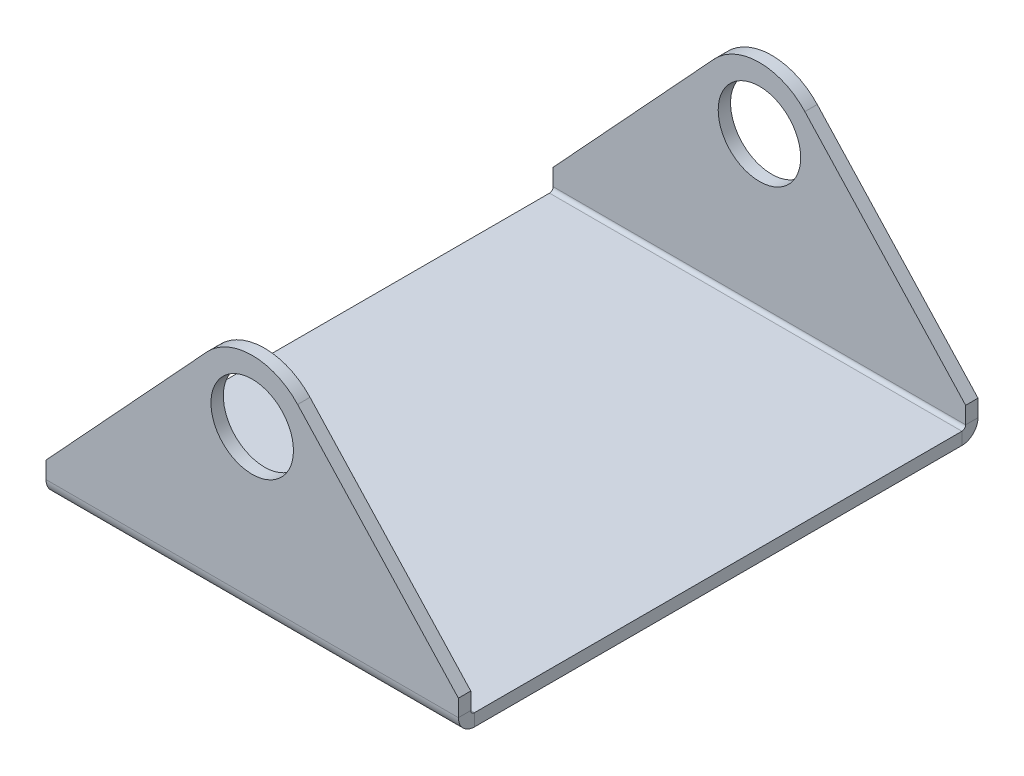
ISO-10303-21;
HEADER;
FILE_DESCRIPTION(('STEP AP214'),'2;1');
FILE_NAME('part.step','',(''),(''),'','','');
FILE_SCHEMA(('AUTOMOTIVE_DESIGN { 1 0 10303 214 1 1 1 1 }'));
ENDSEC;
DATA;
#1=APPLICATION_CONTEXT('core data for automotive mechanical design processes');
#2=APPLICATION_PROTOCOL_DEFINITION('international standard','automotive_design',2000,#1);
#3=PRODUCT_CONTEXT('',#1,'mechanical');
#4=PRODUCT('Part','Part','',(#3));
#5=PRODUCT_RELATED_PRODUCT_CATEGORY('part','',(#4));
#6=PRODUCT_DEFINITION_FORMATION('','',#4);
#7=PRODUCT_DEFINITION_CONTEXT('part definition',#1,'design');
#8=PRODUCT_DEFINITION('design','',#6,#7);
#9=PRODUCT_DEFINITION_SHAPE('','',#8);
#10=(LENGTH_UNIT() NAMED_UNIT(*) SI_UNIT(.MILLI.,.METRE.));
#11=(NAMED_UNIT(*) PLANE_ANGLE_UNIT() SI_UNIT($,.RADIAN.));
#12=(NAMED_UNIT(*) SI_UNIT($,.STERADIAN.) SOLID_ANGLE_UNIT());
#13=UNCERTAINTY_MEASURE_WITH_UNIT(LENGTH_MEASURE(1.E-05),#10,'distance_accuracy_value','');
#14=(GEOMETRIC_REPRESENTATION_CONTEXT(3) GLOBAL_UNCERTAINTY_ASSIGNED_CONTEXT((#13)) GLOBAL_UNIT_ASSIGNED_CONTEXT((#10,
#11,#12)) REPRESENTATION_CONTEXT('',''));
#15=CARTESIAN_POINT('',(0.,0.,0.));
#16=DIRECTION('',(0.,0.,1.));
#17=DIRECTION('',(1.,0.,0.));
#18=AXIS2_PLACEMENT_3D('',#15,#16,#17);
#19=CARTESIAN_POINT('',(0.,3.,-120.));
#20=DIRECTION('',(0.,-1.,0.));
#21=DIRECTION('',(0.,0.,-1.));
#22=AXIS2_PLACEMENT_3D('',#19,#20,#21);
#23=PLANE('',#22);
#24=DIRECTION('',(1.,0.,0.));
#25=VECTOR('',#24,1.);
#26=CARTESIAN_POINT('',(0.,3.,-119.1));
#27=LINE('',#26,#25);
#28=CARTESIAN_POINT('',(0.,3.,-119.1));
#29=VERTEX_POINT('',#28);
#30=CARTESIAN_POINT('',(100.,3.,-119.1));
#31=VERTEX_POINT('',#30);
#32=EDGE_CURVE('E291',#29,#31,#27,.T.);
#33=ORIENTED_EDGE('',*,*,#32,.F.);
#34=DIRECTION('',(0.,0.,1.));
#35=VECTOR('',#34,1.);
#36=CARTESIAN_POINT('',(0.,3.,0.));
#37=LINE('',#36,#35);
#38=CARTESIAN_POINT('',(0.,3.,-0.899999999999997));
#39=VERTEX_POINT('',#38);
#40=EDGE_CURVE('E270',#29,#39,#37,.T.);
#41=ORIENTED_EDGE('',*,*,#40,.T.);
#42=DIRECTION('',(-1.,0.,0.));
#43=VECTOR('',#42,1.);
#44=CARTESIAN_POINT('',(100.,3.,-0.899999999999997));
#45=LINE('',#44,#43);
#46=CARTESIAN_POINT('',(100.,3.,-0.899999999999997));
#47=VERTEX_POINT('',#46);
#48=EDGE_CURVE('E277',#47,#39,#45,.T.);
#49=ORIENTED_EDGE('',*,*,#48,.F.);
#50=DIRECTION('',(0.,0.,-1.));
#51=VECTOR('',#50,1.);
#52=CARTESIAN_POINT('',(100.,3.,0.));
#53=LINE('',#52,#51);
#54=EDGE_CURVE('E273',#47,#31,#53,.T.);
#55=ORIENTED_EDGE('',*,*,#54,.T.);
#56=EDGE_LOOP('',(#33,#41,#49,#55));
#57=FACE_BOUND('',#56,.T.);
#58=ADVANCED_FACE('F36',(#57),#23,.F.);
#59=CARTESIAN_POINT('',(0.,0.,-120.));
#60=DIRECTION('',(0.,-1.,0.));
#61=DIRECTION('',(0.,0.,-1.));
#62=AXIS2_PLACEMENT_3D('',#59,#60,#61);
#63=PLANE('',#62);
#64=DIRECTION('',(0.,0.,-1.));
#65=VECTOR('',#64,1.);
#66=CARTESIAN_POINT('',(0.,0.,-120.));
#67=LINE('',#66,#65);
#68=CARTESIAN_POINT('',(0.,0.,-119.1));
#69=VERTEX_POINT('',#68);
#70=CARTESIAN_POINT('',(0.,0.,-0.899999999999996));
#71=VERTEX_POINT('',#70);
#72=EDGE_CURVE('E266',#69,#71,#67,.F.);
#73=ORIENTED_EDGE('',*,*,#72,.F.);
#74=DIRECTION('',(1.,0.,0.));
#75=VECTOR('',#74,1.);
#76=CARTESIAN_POINT('',(0.,0.,-119.1));
#77=LINE('',#76,#75);
#78=CARTESIAN_POINT('',(100.,0.,-119.1));
#79=VERTEX_POINT('',#78);
#80=EDGE_CURVE('E44',#69,#79,#77,.T.);
#81=ORIENTED_EDGE('',*,*,#80,.T.);
#82=DIRECTION('',(0.,0.,-1.));
#83=VECTOR('',#82,1.);
#84=CARTESIAN_POINT('',(100.,0.,-120.));
#85=LINE('',#84,#83);
#86=CARTESIAN_POINT('',(100.,0.,-0.899999999999997));
#87=VERTEX_POINT('',#86);
#88=EDGE_CURVE('E274',#87,#79,#85,.T.);
#89=ORIENTED_EDGE('',*,*,#88,.F.);
#90=DIRECTION('',(-1.,0.,0.));
#91=VECTOR('',#90,1.);
#92=CARTESIAN_POINT('',(100.,0.,-0.899999999999997));
#93=LINE('',#92,#91);
#94=EDGE_CURVE('E285',#87,#71,#93,.T.);
#95=ORIENTED_EDGE('',*,*,#94,.T.);
#96=EDGE_LOOP('',(#73,#81,#89,#95));
#97=FACE_BOUND('',#96,.T.);
#98=ADVANCED_FACE('F298',(#97),#63,.T.);
#99=CARTESIAN_POINT('',(0.,3.,0.));
#100=DIRECTION('',(1.,0.,0.));
#101=DIRECTION('',(0.,0.,1.));
#102=AXIS2_PLACEMENT_3D('',#99,#100,#101);
#103=PLANE('',#102);
#104=ORIENTED_EDGE('',*,*,#40,.F.);
#105=DIRECTION('',(0.,-1.,0.));
#106=VECTOR('',#105,1.);
#107=CARTESIAN_POINT('',(0.,3.,-119.1));
#108=LINE('',#107,#106);
#109=EDGE_CURVE('E11',#29,#69,#108,.T.);
#110=ORIENTED_EDGE('',*,*,#109,.T.);
#111=ORIENTED_EDGE('',*,*,#72,.T.);
#112=DIRECTION('',(0.,-1.,0.));
#113=VECTOR('',#112,1.);
#114=CARTESIAN_POINT('',(0.,3.,-0.899999999999997));
#115=LINE('',#114,#113);
#116=EDGE_CURVE('E283',#39,#71,#115,.T.);
#117=ORIENTED_EDGE('',*,*,#116,.F.);
#118=EDGE_LOOP('',(#104,#110,#111,#117));
#119=FACE_BOUND('',#118,.T.);
#120=ADVANCED_FACE('F321',(#119),#103,.F.);
#121=CARTESIAN_POINT('',(100.,3.,0.));
#122=DIRECTION('',(-1.,0.,0.));
#123=DIRECTION('',(0.,0.,-1.));
#124=AXIS2_PLACEMENT_3D('',#121,#122,#123);
#125=PLANE('',#124);
#126=DIRECTION('',(0.,-1.,0.));
#127=VECTOR('',#126,1.);
#128=CARTESIAN_POINT('',(100.,3.,-119.1));
#129=LINE('',#128,#127);
#130=EDGE_CURVE('E293',#31,#79,#129,.T.);
#131=ORIENTED_EDGE('',*,*,#130,.F.);
#132=ORIENTED_EDGE('',*,*,#54,.F.);
#133=DIRECTION('',(0.,-1.,0.));
#134=VECTOR('',#133,1.);
#135=CARTESIAN_POINT('',(100.,3.,-0.899999999999997));
#136=LINE('',#135,#134);
#137=EDGE_CURVE('E288',#47,#87,#136,.T.);
#138=ORIENTED_EDGE('',*,*,#137,.T.);
#139=ORIENTED_EDGE('',*,*,#88,.T.);
#140=EDGE_LOOP('',(#131,#132,#138,#139));
#141=FACE_BOUND('',#140,.T.);
#142=ADVANCED_FACE('F38',(#141),#125,.F.);
#143=CARTESIAN_POINT('',(100.,3.9,-0.899999999999997));
#144=DIRECTION('',(-1.,0.,0.));
#145=DIRECTION('',(0.,0.,1.));
#146=AXIS2_PLACEMENT_3D('',#143,#144,#145);
#147=PLANE('',#146);
#148=DIRECTION('',(0.,0.,1.));
#149=VECTOR('',#148,1.);
#150=CARTESIAN_POINT('',(100.,3.90000000000002,0.));
#151=LINE('',#150,#149);
#152=CARTESIAN_POINT('',(100.,3.89999999999999,0.));
#153=VERTEX_POINT('',#152);
#154=CARTESIAN_POINT('',(100.,3.90000000000002,2.99999999999999));
#155=VERTEX_POINT('',#154);
#156=EDGE_CURVE('E255',#153,#155,#151,.T.);
#157=ORIENTED_EDGE('',*,*,#156,.T.);
#158=CARTESIAN_POINT('',(100.,3.9,-0.899999999999997));
#159=DIRECTION('',(1.,0.,0.));
#160=DIRECTION('',(0.,0.,-1.));
#161=AXIS2_PLACEMENT_3D('',#158,#159,#160);
#162=CIRCLE('',#161,3.9);
#163=EDGE_CURVE('E59',#155,#87,#162,.T.);
#164=ORIENTED_EDGE('',*,*,#163,.T.);
#165=ORIENTED_EDGE('',*,*,#137,.F.);
#166=CARTESIAN_POINT('',(100.,3.9,-0.899999999999997));
#167=DIRECTION('',(1.,0.,0.));
#168=DIRECTION('',(0.,0.,-1.));
#169=AXIS2_PLACEMENT_3D('',#166,#167,#168);
#170=CIRCLE('',#169,0.9);
#171=EDGE_CURVE('E259',#153,#47,#170,.T.);
#172=ORIENTED_EDGE('',*,*,#171,.F.);
#173=EDGE_LOOP('',(#157,#164,#165,#172));
#174=FACE_BOUND('',#173,.T.);
#175=ADVANCED_FACE('F311',(#174),#147,.F.);
#176=CARTESIAN_POINT('',(0.,3.9,-0.899999999999997));
#177=DIRECTION('',(1.,0.,0.));
#178=DIRECTION('',(0.,0.,-1.));
#179=AXIS2_PLACEMENT_3D('',#176,#177,#178);
#180=PLANE('',#179);
#181=CARTESIAN_POINT('',(0.,3.9,-0.899999999999997));
#182=DIRECTION('',(1.,0.,0.));
#183=DIRECTION('',(0.,0.,-1.));
#184=AXIS2_PLACEMENT_3D('',#181,#182,#183);
#185=CIRCLE('',#184,3.9);
#186=CARTESIAN_POINT('',(0.,3.90000000000001,2.99999999999999));
#187=VERTEX_POINT('',#186);
#188=EDGE_CURVE('E263',#71,#187,#185,.F.);
#189=ORIENTED_EDGE('',*,*,#188,.T.);
#190=DIRECTION('',(0.,0.,1.));
#191=VECTOR('',#190,1.);
#192=CARTESIAN_POINT('',(0.,3.90000000000002,0.));
#193=LINE('',#192,#191);
#194=CARTESIAN_POINT('',(0.,3.90000000000002,0.));
#195=VERTEX_POINT('',#194);
#196=EDGE_CURVE('E215',#195,#187,#193,.T.);
#197=ORIENTED_EDGE('',*,*,#196,.F.);
#198=CARTESIAN_POINT('',(0.,3.9,-0.899999999999997));
#199=DIRECTION('',(-1.,0.,0.));
#200=DIRECTION('',(0.,0.,1.));
#201=AXIS2_PLACEMENT_3D('',#198,#199,#200);
#202=CIRCLE('',#201,0.9);
#203=EDGE_CURVE('E262',#39,#195,#202,.T.);
#204=ORIENTED_EDGE('',*,*,#203,.F.);
#205=ORIENTED_EDGE('',*,*,#116,.T.);
#206=EDGE_LOOP('',(#189,#197,#204,#205));
#207=FACE_BOUND('',#206,.T.);
#208=ADVANCED_FACE('F324',(#207),#180,.F.);
#209=CARTESIAN_POINT('',(-50.1159938787883,3.9,-0.899999999999997));
#210=DIRECTION('',(1.,0.,0.));
#211=DIRECTION('',(0.,0.,-1.));
#212=AXIS2_PLACEMENT_3D('',#209,#210,#211);
#213=CYLINDRICAL_SURFACE('',#212,0.9);
#214=ORIENTED_EDGE('',*,*,#48,.T.);
#215=ORIENTED_EDGE('',*,*,#203,.T.);
#216=DIRECTION('',(1.,0.,0.));
#217=VECTOR('',#216,1.);
#218=CARTESIAN_POINT('',(0.,3.90000000000002,0.));
#219=LINE('',#218,#217);
#220=EDGE_CURVE('E202',#195,#153,#219,.T.);
#221=ORIENTED_EDGE('',*,*,#220,.T.);
#222=ORIENTED_EDGE('',*,*,#171,.T.);
#223=EDGE_LOOP('',(#214,#215,#221,#222));
#224=FACE_BOUND('',#223,.T.);
#225=ADVANCED_FACE('F314',(#224),#213,.F.);
#226=CARTESIAN_POINT('',(-50.1159938787883,3.9,-0.899999999999997));
#227=DIRECTION('',(1.,0.,0.));
#228=DIRECTION('',(0.,0.,-1.));
#229=AXIS2_PLACEMENT_3D('',#226,#227,#228);
#230=CYLINDRICAL_SURFACE('',#229,3.9);
#231=ORIENTED_EDGE('',*,*,#94,.F.);
#232=ORIENTED_EDGE('',*,*,#163,.F.);
#233=DIRECTION('',(1.,0.,0.));
#234=VECTOR('',#233,1.);
#235=CARTESIAN_POINT('',(100.,3.90000000000002,2.99999999999999));
#236=LINE('',#235,#234);
#237=EDGE_CURVE('E212',#187,#155,#236,.T.);
#238=ORIENTED_EDGE('',*,*,#237,.F.);
#239=ORIENTED_EDGE('',*,*,#188,.F.);
#240=EDGE_LOOP('',(#231,#232,#238,#239));
#241=FACE_BOUND('',#240,.T.);
#242=ADVANCED_FACE('F328',(#241),#230,.T.);
#243=CARTESIAN_POINT('',(50.,40.,1.08853898117545E-13));
#244=DIRECTION('',(0.,0.,1.));
#245=DIRECTION('',(0.,-1.,0.));
#246=AXIS2_PLACEMENT_3D('',#243,#244,#245);
#247=CYLINDRICAL_SURFACE('',#246,15.);
#248=CARTESIAN_POINT('',(50.,40.,3.00000000000011));
#249=DIRECTION('',(0.,0.,1.));
#250=DIRECTION('',(0.,-1.,0.));
#251=AXIS2_PLACEMENT_3D('',#248,#249,#250);
#252=CIRCLE('',#251,15.);
#253=CARTESIAN_POINT('',(38.984187706275,50.1809567089453,3.00000000000015));
#254=VERTEX_POINT('',#253);
#255=CARTESIAN_POINT('',(61.015812293725,50.1809567089453,3.00000000000015));
#256=VERTEX_POINT('',#255);
#257=EDGE_CURVE('E253',#254,#256,#252,.F.);
#258=ORIENTED_EDGE('',*,*,#257,.T.);
#259=DIRECTION('',(0.,0.,-1.));
#260=VECTOR('',#259,1.);
#261=CARTESIAN_POINT('',(61.015812293725,50.1809567089453,0.));
#262=LINE('',#261,#260);
#263=CARTESIAN_POINT('',(61.015812293725,50.1809567089453,0.));
#264=VERTEX_POINT('',#263);
#265=EDGE_CURVE('E243',#264,#256,#262,.F.);
#266=ORIENTED_EDGE('',*,*,#265,.F.);
#267=CARTESIAN_POINT('',(50.,40.,1.08853898117545E-13));
#268=DIRECTION('',(0.,0.,1.));
#269=DIRECTION('',(0.,-1.,0.));
#270=AXIS2_PLACEMENT_3D('',#267,#268,#269);
#271=CIRCLE('',#270,15.);
#272=CARTESIAN_POINT('',(38.984187706275,50.1809567089453,0.));
#273=VERTEX_POINT('',#272);
#274=EDGE_CURVE('E221',#273,#264,#271,.F.);
#275=ORIENTED_EDGE('',*,*,#274,.F.);
#276=DIRECTION('',(0.,0.,-1.));
#277=VECTOR('',#276,1.);
#278=CARTESIAN_POINT('',(38.984187706275,50.1809567089453,0.));
#279=LINE('',#278,#277);
#280=EDGE_CURVE('E250',#273,#254,#279,.F.);
#281=ORIENTED_EDGE('',*,*,#280,.T.);
#282=EDGE_LOOP('',(#258,#266,#275,#281));
#283=FACE_BOUND('',#282,.T.);
#284=ADVANCED_FACE('F345',(#283),#247,.T.);
#285=CARTESIAN_POINT('',(43.5752462691572,55.1484898007787,1.66099772824779E-13));
#286=DIRECTION('',(0.734387486248332,-0.678730447263018,0.));
#287=DIRECTION('',(0.678730447263018,0.734387486248332,0.));
#288=AXIS2_PLACEMENT_3D('',#285,#286,#287);
#289=PLANE('',#288);
#290=ORIENTED_EDGE('',*,*,#280,.F.);
#291=DIRECTION('',(0.678730447263018,0.734387486248332,0.));
#292=VECTOR('',#291,1.);
#293=CARTESIAN_POINT('',(43.5752462691572,55.1484898007787,1.66099772824779E-13));
#294=LINE('',#293,#292);
#295=CARTESIAN_POINT('',(0.,8.00000000000002,0.));
#296=VERTEX_POINT('',#295);
#297=EDGE_CURVE('E223',#296,#273,#294,.T.);
#298=ORIENTED_EDGE('',*,*,#297,.F.);
#299=DIRECTION('',(0.,0.,-1.));
#300=VECTOR('',#299,1.);
#301=CARTESIAN_POINT('',(0.,8.00000000000002,0.));
#302=LINE('',#301,#300);
#303=CARTESIAN_POINT('',(0.,8.00000000000001,3.));
#304=VERTEX_POINT('',#303);
#305=EDGE_CURVE('E248',#296,#304,#302,.F.);
#306=ORIENTED_EDGE('',*,*,#305,.T.);
#307=DIRECTION('',(0.678730447263018,0.734387486248332,0.));
#308=VECTOR('',#307,1.);
#309=CARTESIAN_POINT('',(43.5752462691572,55.1484898007787,3.00000000000017));
#310=LINE('',#309,#308);
#311=EDGE_CURVE('E246',#304,#254,#310,.T.);
#312=ORIENTED_EDGE('',*,*,#311,.T.);
#313=EDGE_LOOP('',(#290,#298,#306,#312));
#314=FACE_BOUND('',#313,.T.);
#315=ADVANCED_FACE('F352',(#314),#289,.F.);
#316=CARTESIAN_POINT('',(102.492255735029,5.30337510020933,0.));
#317=DIRECTION('',(-0.734387486248332,-0.678730447263018,0.));
#318=DIRECTION('',(0.678730447263018,-0.734387486248332,0.));
#319=AXIS2_PLACEMENT_3D('',#316,#317,#318);
#320=PLANE('',#319);
#321=DIRECTION('',(0.,0.,-1.));
#322=VECTOR('',#321,1.);
#323=CARTESIAN_POINT('',(100.,8.00000000000007,0.));
#324=LINE('',#323,#322);
#325=CARTESIAN_POINT('',(100.,8.00000000000007,0.));
#326=VERTEX_POINT('',#325);
#327=CARTESIAN_POINT('',(100.,8.00000000000006,3.));
#328=VERTEX_POINT('',#327);
#329=EDGE_CURVE('E209',#326,#328,#324,.F.);
#330=ORIENTED_EDGE('',*,*,#329,.F.);
#331=DIRECTION('',(0.678730447263018,-0.734387486248332,0.));
#332=VECTOR('',#331,1.);
#333=CARTESIAN_POINT('',(102.492255735029,5.30337510020933,0.));
#334=LINE('',#333,#332);
#335=EDGE_CURVE('E232',#264,#326,#334,.T.);
#336=ORIENTED_EDGE('',*,*,#335,.F.);
#337=ORIENTED_EDGE('',*,*,#265,.T.);
#338=DIRECTION('',(0.678730447263018,-0.734387486248332,0.));
#339=VECTOR('',#338,1.);
#340=CARTESIAN_POINT('',(102.492255735029,5.30337510020932,2.99999999999999));
#341=LINE('',#340,#339);
#342=EDGE_CURVE('E241',#256,#328,#341,.T.);
#343=ORIENTED_EDGE('',*,*,#342,.T.);
#344=EDGE_LOOP('',(#330,#336,#337,#343));
#345=FACE_BOUND('',#344,.T.);
#346=ADVANCED_FACE('F343',(#345),#320,.F.);
#347=CARTESIAN_POINT('',(50.,40.,-123.));
#348=DIRECTION('',(0.,0.,1.));
#349=DIRECTION('',(1.,0.,0.));
#350=AXIS2_PLACEMENT_3D('',#347,#348,#349);
#351=CYLINDRICAL_SURFACE('',#350,10.);
#352=CARTESIAN_POINT('',(50.,40.,2.99999999999997));
#353=DIRECTION('',(0.,0.,1.));
#354=DIRECTION('',(1.,0.,0.));
#355=AXIS2_PLACEMENT_3D('',#352,#353,#354);
#356=CIRCLE('',#355,10.);
#357=CARTESIAN_POINT('',(60.,40.,2.99999999999997));
#358=VERTEX_POINT('',#357);
#359=EDGE_CURVE('E238',#358,#358,#356,.T.);
#360=ORIENTED_EDGE('',*,*,#359,.T.);
#361=EDGE_LOOP('',(#360));
#362=FACE_BOUND('',#361,.T.);
#363=CARTESIAN_POINT('',(50.,40.,1.08853898117545E-13));
#364=DIRECTION('',(0.,0.,1.));
#365=DIRECTION('',(0.,-1.,0.));
#366=AXIS2_PLACEMENT_3D('',#363,#364,#365);
#367=CIRCLE('',#366,10.);
#368=CARTESIAN_POINT('',(50.,30.,0.));
#369=VERTEX_POINT('',#368);
#370=EDGE_CURVE('E235',#369,#369,#367,.T.);
#371=ORIENTED_EDGE('',*,*,#370,.F.);
#372=EDGE_LOOP('',(#371));
#373=FACE_BOUND('',#372,.T.);
#374=ADVANCED_FACE('F359',(#362,#373),#351,.F.);
#375=CARTESIAN_POINT('',(100.,3.00000000000002,0.));
#376=DIRECTION('',(0.,0.,1.));
#377=DIRECTION('',(0.,-1.,0.));
#378=AXIS2_PLACEMENT_3D('',#375,#376,#377);
#379=PLANE('',#378);
#380=ORIENTED_EDGE('',*,*,#370,.T.);
#381=EDGE_LOOP('',(#380));
#382=FACE_BOUND('',#381,.T.);
#383=ORIENTED_EDGE('',*,*,#335,.T.);
#384=DIRECTION('',(0.,-1.,0.));
#385=VECTOR('',#384,1.);
#386=CARTESIAN_POINT('',(100.,3.00000000000002,0.));
#387=LINE('',#386,#385);
#388=EDGE_CURVE('E229',#326,#153,#387,.T.);
#389=ORIENTED_EDGE('',*,*,#388,.T.);
#390=ORIENTED_EDGE('',*,*,#220,.F.);
#391=DIRECTION('',(0.,1.,0.));
#392=VECTOR('',#391,1.);
#393=CARTESIAN_POINT('',(0.,55.,1.65232411086791E-13));
#394=LINE('',#393,#392);
#395=EDGE_CURVE('E226',#195,#296,#394,.T.);
#396=ORIENTED_EDGE('',*,*,#395,.T.);
#397=ORIENTED_EDGE('',*,*,#297,.T.);
#398=ORIENTED_EDGE('',*,*,#274,.T.);
#399=EDGE_LOOP('',(#383,#389,#390,#396,#397,#398));
#400=FACE_BOUND('',#399,.T.);
#401=ADVANCED_FACE('F338',(#382,#400),#379,.F.);
#402=CARTESIAN_POINT('',(0.,55.,3.00000000000017));
#403=DIRECTION('',(-1.,0.,0.));
#404=DIRECTION('',(0.,0.,1.));
#405=AXIS2_PLACEMENT_3D('',#402,#403,#404);
#406=PLANE('',#405);
#407=DIRECTION('',(0.,1.,0.));
#408=VECTOR('',#407,1.);
#409=CARTESIAN_POINT('',(0.,55.,3.00000000000017));
#410=LINE('',#409,#408);
#411=EDGE_CURVE('E218',#187,#304,#410,.T.);
#412=ORIENTED_EDGE('',*,*,#411,.T.);
#413=ORIENTED_EDGE('',*,*,#305,.F.);
#414=ORIENTED_EDGE('',*,*,#395,.F.);
#415=ORIENTED_EDGE('',*,*,#196,.T.);
#416=EDGE_LOOP('',(#412,#413,#414,#415));
#417=FACE_BOUND('',#416,.T.);
#418=ADVANCED_FACE('F351',(#417),#406,.T.);
#419=CARTESIAN_POINT('',(100.,3.00000000000001,2.99999999999998));
#420=DIRECTION('',(0.,0.,1.));
#421=DIRECTION('',(0.,-1.,0.));
#422=AXIS2_PLACEMENT_3D('',#419,#420,#421);
#423=PLANE('',#422);
#424=ORIENTED_EDGE('',*,*,#359,.F.);
#425=EDGE_LOOP('',(#424));
#426=FACE_BOUND('',#425,.T.);
#427=DIRECTION('',(0.,-1.,0.));
#428=VECTOR('',#427,1.);
#429=CARTESIAN_POINT('',(100.,3.00000000000001,2.99999999999998));
#430=LINE('',#429,#428);
#431=EDGE_CURVE('E207',#328,#155,#430,.T.);
#432=ORIENTED_EDGE('',*,*,#431,.F.);
#433=ORIENTED_EDGE('',*,*,#342,.F.);
#434=ORIENTED_EDGE('',*,*,#257,.F.);
#435=ORIENTED_EDGE('',*,*,#311,.F.);
#436=ORIENTED_EDGE('',*,*,#411,.F.);
#437=ORIENTED_EDGE('',*,*,#237,.T.);
#438=EDGE_LOOP('',(#432,#433,#434,#435,#436,#437));
#439=FACE_BOUND('',#438,.T.);
#440=ADVANCED_FACE('F331',(#426,#439),#423,.T.);
#441=CARTESIAN_POINT('',(100.,3.00000000000001,2.99999999999998));
#442=DIRECTION('',(1.,0.,0.));
#443=DIRECTION('',(0.,0.,-1.));
#444=AXIS2_PLACEMENT_3D('',#441,#442,#443);
#445=PLANE('',#444);
#446=ORIENTED_EDGE('',*,*,#388,.F.);
#447=ORIENTED_EDGE('',*,*,#329,.T.);
#448=ORIENTED_EDGE('',*,*,#431,.T.);
#449=ORIENTED_EDGE('',*,*,#156,.F.);
#450=EDGE_LOOP('',(#446,#447,#448,#449));
#451=FACE_BOUND('',#450,.T.);
#452=ADVANCED_FACE('F336',(#451),#445,.T.);
#453=CARTESIAN_POINT('',(0.,3.9,-119.1));
#454=DIRECTION('',(1.,0.,0.));
#455=DIRECTION('',(0.,0.,-1.));
#456=AXIS2_PLACEMENT_3D('',#453,#454,#455);
#457=PLANE('',#456);
#458=DIRECTION('',(0.,0.,-1.));
#459=VECTOR('',#458,1.);
#460=CARTESIAN_POINT('',(0.,3.90000000000003,-120.));
#461=LINE('',#460,#459);
#462=CARTESIAN_POINT('',(0.,3.9,-120.));
#463=VERTEX_POINT('',#462);
#464=CARTESIAN_POINT('',(0.,3.90000000000006,-123.));
#465=VERTEX_POINT('',#464);
#466=EDGE_CURVE('E190',#463,#465,#461,.T.);
#467=ORIENTED_EDGE('',*,*,#466,.T.);
#468=CARTESIAN_POINT('',(0.,3.9,-119.1));
#469=DIRECTION('',(-1.,0.,0.));
#470=DIRECTION('',(0.,0.,1.));
#471=AXIS2_PLACEMENT_3D('',#468,#469,#470);
#472=CIRCLE('',#471,3.9);
#473=EDGE_CURVE('E51',#465,#69,#472,.T.);
#474=ORIENTED_EDGE('',*,*,#473,.T.);
#475=ORIENTED_EDGE('',*,*,#109,.F.);
#476=CARTESIAN_POINT('',(0.,3.9,-119.1));
#477=DIRECTION('',(-1.,0.,0.));
#478=DIRECTION('',(0.,0.,1.));
#479=AXIS2_PLACEMENT_3D('',#476,#477,#478);
#480=CIRCLE('',#479,0.899999999999999);
#481=EDGE_CURVE('E195',#463,#29,#480,.T.);
#482=ORIENTED_EDGE('',*,*,#481,.F.);
#483=EDGE_LOOP('',(#467,#474,#475,#482));
#484=FACE_BOUND('',#483,.T.);
#485=ADVANCED_FACE('F387',(#484),#457,.F.);
#486=CARTESIAN_POINT('',(100.,3.9,-119.1));
#487=DIRECTION('',(-1.,0.,0.));
#488=DIRECTION('',(0.,0.,1.));
#489=AXIS2_PLACEMENT_3D('',#486,#487,#488);
#490=PLANE('',#489);
#491=CARTESIAN_POINT('',(100.,3.9,-119.1));
#492=DIRECTION('',(-1.,0.,0.));
#493=DIRECTION('',(0.,0.,1.));
#494=AXIS2_PLACEMENT_3D('',#491,#492,#493);
#495=CIRCLE('',#494,3.9);
#496=CARTESIAN_POINT('',(100.,3.90000000000003,-123.));
#497=VERTEX_POINT('',#496);
#498=EDGE_CURVE('E199',#79,#497,#495,.F.);
#499=ORIENTED_EDGE('',*,*,#498,.T.);
#500=DIRECTION('',(0.,0.,-1.));
#501=VECTOR('',#500,1.);
#502=CARTESIAN_POINT('',(100.,3.90000000000003,-120.));
#503=LINE('',#502,#501);
#504=CARTESIAN_POINT('',(100.,3.90000000000001,-120.));
#505=VERTEX_POINT('',#504);
#506=EDGE_CURVE('E676',#505,#497,#503,.T.);
#507=ORIENTED_EDGE('',*,*,#506,.F.);
#508=CARTESIAN_POINT('',(100.,3.9,-119.1));
#509=DIRECTION('',(1.,0.,0.));
#510=DIRECTION('',(0.,0.,-1.));
#511=AXIS2_PLACEMENT_3D('',#508,#509,#510);
#512=CIRCLE('',#511,0.899999999999999);
#513=EDGE_CURVE('E198',#31,#505,#512,.T.);
#514=ORIENTED_EDGE('',*,*,#513,.F.);
#515=ORIENTED_EDGE('',*,*,#130,.T.);
#516=EDGE_LOOP('',(#499,#507,#514,#515));
#517=FACE_BOUND('',#516,.T.);
#518=ADVANCED_FACE('F427',(#517),#490,.F.);
#519=CARTESIAN_POINT('',(150.115993878788,3.9,-119.1));
#520=DIRECTION('',(-1.,0.,0.));
#521=DIRECTION('',(0.,0.,1.));
#522=AXIS2_PLACEMENT_3D('',#519,#520,#521);
#523=CYLINDRICAL_SURFACE('',#522,0.9);
#524=ORIENTED_EDGE('',*,*,#32,.T.);
#525=ORIENTED_EDGE('',*,*,#513,.T.);
#526=DIRECTION('',(-1.,0.,0.));
#527=VECTOR('',#526,1.);
#528=CARTESIAN_POINT('',(100.,3.90000000000003,-120.));
#529=LINE('',#528,#527);
#530=EDGE_CURVE('E192',#505,#463,#529,.T.);
#531=ORIENTED_EDGE('',*,*,#530,.T.);
#532=ORIENTED_EDGE('',*,*,#481,.T.);
#533=EDGE_LOOP('',(#524,#525,#531,#532));
#534=FACE_BOUND('',#533,.T.);
#535=ADVANCED_FACE('F434',(#534),#523,.F.);
#536=CARTESIAN_POINT('',(150.115993878788,3.9,-119.1));
#537=DIRECTION('',(-1.,0.,0.));
#538=DIRECTION('',(0.,0.,1.));
#539=AXIS2_PLACEMENT_3D('',#536,#537,#538);
#540=CYLINDRICAL_SURFACE('',#539,3.9);
#541=ORIENTED_EDGE('',*,*,#80,.F.);
#542=ORIENTED_EDGE('',*,*,#473,.F.);
#543=DIRECTION('',(-1.,0.,0.));
#544=VECTOR('',#543,1.);
#545=CARTESIAN_POINT('',(0.,3.90000000000006,-123.));
#546=LINE('',#545,#544);
#547=EDGE_CURVE('E304',#497,#465,#546,.T.);
#548=ORIENTED_EDGE('',*,*,#547,.F.);
#549=ORIENTED_EDGE('',*,*,#498,.F.);
#550=EDGE_LOOP('',(#541,#542,#548,#549));
#551=FACE_BOUND('',#550,.T.);
#552=ADVANCED_FACE('F301',(#551),#540,.T.);
#553=CARTESIAN_POINT('',(50.,40.,-120.));
#554=DIRECTION('',(0.,0.,-1.));
#555=DIRECTION('',(-1.,0.,0.));
#556=AXIS2_PLACEMENT_3D('',#553,#554,#555);
#557=CYLINDRICAL_SURFACE('',#556,15.);
#558=CARTESIAN_POINT('',(50.,40.,-123.));
#559=DIRECTION('',(0.,0.,-1.));
#560=DIRECTION('',(-1.,0.,0.));
#561=AXIS2_PLACEMENT_3D('',#558,#559,#560);
#562=CIRCLE('',#561,15.);
#563=CARTESIAN_POINT('',(61.015812293725,50.1809567089453,-123.));
#564=VERTEX_POINT('',#563);
#565=CARTESIAN_POINT('',(38.984187706275,50.1809567089453,-123.));
#566=VERTEX_POINT('',#565);
#567=EDGE_CURVE('E177',#564,#566,#562,.F.);
#568=ORIENTED_EDGE('',*,*,#567,.T.);
#569=DIRECTION('',(0.,0.,1.));
#570=VECTOR('',#569,1.);
#571=CARTESIAN_POINT('',(38.984187706275,50.1809567089453,-120.));
#572=LINE('',#571,#570);
#573=CARTESIAN_POINT('',(38.984187706275,50.1809567089453,-120.));
#574=VERTEX_POINT('',#573);
#575=EDGE_CURVE('E168',#574,#566,#572,.F.);
#576=ORIENTED_EDGE('',*,*,#575,.F.);
#577=CARTESIAN_POINT('',(50.,40.,-120.));
#578=DIRECTION('',(0.,0.,-1.));
#579=DIRECTION('',(-1.,0.,0.));
#580=AXIS2_PLACEMENT_3D('',#577,#578,#579);
#581=CIRCLE('',#580,15.);
#582=CARTESIAN_POINT('',(61.015812293725,50.1809567089453,-120.));
#583=VERTEX_POINT('',#582);
#584=EDGE_CURVE('E151',#583,#574,#581,.F.);
#585=ORIENTED_EDGE('',*,*,#584,.F.);
#586=DIRECTION('',(0.,0.,1.));
#587=VECTOR('',#586,1.);
#588=CARTESIAN_POINT('',(61.015812293725,50.1809567089453,-120.));
#589=LINE('',#588,#587);
#590=EDGE_CURVE('E187',#583,#564,#589,.F.);
#591=ORIENTED_EDGE('',*,*,#590,.T.);
#592=EDGE_LOOP('',(#568,#576,#585,#591));
#593=FACE_BOUND('',#592,.T.);
#594=ADVANCED_FACE('F175',(#593),#557,.T.);
#595=CARTESIAN_POINT('',(56.4247537308428,55.1484898007787,-120.));
#596=DIRECTION('',(-0.734387486248332,-0.678730447263018,0.));
#597=DIRECTION('',(-0.678730447263018,0.734387486248332,0.));
#598=AXIS2_PLACEMENT_3D('',#595,#596,#597);
#599=PLANE('',#598);
#600=ORIENTED_EDGE('',*,*,#590,.F.);
#601=DIRECTION('',(-0.678730447263018,0.734387486248332,0.));
#602=VECTOR('',#601,1.);
#603=CARTESIAN_POINT('',(56.4247537308428,55.1484898007787,-120.));
#604=LINE('',#603,#602);
#605=CARTESIAN_POINT('',(100.,8.0000000000001,-120.));
#606=VERTEX_POINT('',#605);
#607=EDGE_CURVE('E158',#606,#583,#604,.T.);
#608=ORIENTED_EDGE('',*,*,#607,.F.);
#609=DIRECTION('',(0.,0.,1.));
#610=VECTOR('',#609,1.);
#611=CARTESIAN_POINT('',(100.,8.0000000000001,-120.));
#612=LINE('',#611,#610);
#613=CARTESIAN_POINT('',(100.,8.00000000000008,-123.));
#614=VERTEX_POINT('',#613);
#615=EDGE_CURVE('E182',#606,#614,#612,.F.);
#616=ORIENTED_EDGE('',*,*,#615,.T.);
#617=DIRECTION('',(-0.678730447263018,0.734387486248332,0.));
#618=VECTOR('',#617,1.);
#619=CARTESIAN_POINT('',(56.4247537308428,55.1484898007787,-123.));
#620=LINE('',#619,#618);
#621=EDGE_CURVE('E179',#614,#564,#620,.T.);
#622=ORIENTED_EDGE('',*,*,#621,.T.);
#623=EDGE_LOOP('',(#600,#608,#616,#622));
#624=FACE_BOUND('',#623,.T.);
#625=ADVANCED_FACE('F454',(#624),#599,.F.);
#626=CARTESIAN_POINT('',(-2.49225573502847,5.30337510020931,-120.));
#627=DIRECTION('',(0.734387486248332,-0.678730447263018,0.));
#628=DIRECTION('',(-0.678730447263018,-0.734387486248332,0.));
#629=AXIS2_PLACEMENT_3D('',#626,#627,#628);
#630=PLANE('',#629);
#631=DIRECTION('',(0.,0.,1.));
#632=VECTOR('',#631,1.);
#633=CARTESIAN_POINT('',(0.,8.00000000000005,-120.));
#634=LINE('',#633,#632);
#635=CARTESIAN_POINT('',(0.,8.00000000000005,-120.));
#636=VERTEX_POINT('',#635);
#637=CARTESIAN_POINT('',(0.,8.00000000000002,-123.));
#638=VERTEX_POINT('',#637);
#639=EDGE_CURVE('E171',#636,#638,#634,.F.);
#640=ORIENTED_EDGE('',*,*,#639,.F.);
#641=DIRECTION('',(-0.678730447263018,-0.734387486248332,0.));
#642=VECTOR('',#641,1.);
#643=CARTESIAN_POINT('',(-2.49225573502847,5.30337510020931,-120.));
#644=LINE('',#643,#642);
#645=EDGE_CURVE('E155',#574,#636,#644,.T.);
#646=ORIENTED_EDGE('',*,*,#645,.F.);
#647=ORIENTED_EDGE('',*,*,#575,.T.);
#648=DIRECTION('',(-0.678730447263018,-0.734387486248332,0.));
#649=VECTOR('',#648,1.);
#650=CARTESIAN_POINT('',(-2.49225573502847,5.30337510020931,-123.));
#651=LINE('',#650,#649);
#652=EDGE_CURVE('E178',#566,#638,#651,.T.);
#653=ORIENTED_EDGE('',*,*,#652,.T.);
#654=EDGE_LOOP('',(#640,#646,#647,#653));
#655=FACE_BOUND('',#654,.T.);
#656=ADVANCED_FACE('F167',(#655),#630,.F.);
#657=CARTESIAN_POINT('',(50.,40.,-123.));
#658=DIRECTION('',(0.,0.,1.));
#659=DIRECTION('',(1.,0.,0.));
#660=AXIS2_PLACEMENT_3D('',#657,#658,#659);
#661=CYLINDRICAL_SURFACE('',#660,10.);
#662=CARTESIAN_POINT('',(50.,40.,-123.));
#663=DIRECTION('',(0.,0.,1.));
#664=DIRECTION('',(1.,0.,0.));
#665=AXIS2_PLACEMENT_3D('',#662,#663,#664);
#666=CIRCLE('',#665,10.);
#667=CARTESIAN_POINT('',(60.,40.,-123.));
#668=VERTEX_POINT('',#667);
#669=EDGE_CURVE('E679',#668,#668,#666,.T.);
#670=ORIENTED_EDGE('',*,*,#669,.F.);
#671=EDGE_LOOP('',(#670));
#672=FACE_BOUND('',#671,.T.);
#673=CARTESIAN_POINT('',(50.,40.,-120.));
#674=DIRECTION('',(0.,0.,-1.));
#675=DIRECTION('',(-1.,0.,0.));
#676=AXIS2_PLACEMENT_3D('',#673,#674,#675);
#677=CIRCLE('',#676,10.);
#678=CARTESIAN_POINT('',(40.,40.,-120.));
#679=VERTEX_POINT('',#678);
#680=EDGE_CURVE('E173',#679,#679,#677,.T.);
#681=ORIENTED_EDGE('',*,*,#680,.F.);
#682=EDGE_LOOP('',(#681));
#683=FACE_BOUND('',#682,.T.);
#684=ADVANCED_FACE('F468',(#672,#683),#661,.F.);
#685=CARTESIAN_POINT('',(0.,3.00000000000003,-120.));
#686=DIRECTION('',(0.,0.,-1.));
#687=DIRECTION('',(-1.,0.,0.));
#688=AXIS2_PLACEMENT_3D('',#685,#686,#687);
#689=PLANE('',#688);
#690=ORIENTED_EDGE('',*,*,#680,.T.);
#691=EDGE_LOOP('',(#690));
#692=FACE_BOUND('',#691,.T.);
#693=ORIENTED_EDGE('',*,*,#645,.T.);
#694=DIRECTION('',(0.,-1.,0.));
#695=VECTOR('',#694,1.);
#696=CARTESIAN_POINT('',(0.,3.00000000000003,-120.));
#697=LINE('',#696,#695);
#698=EDGE_CURVE('E172',#636,#463,#697,.T.);
#699=ORIENTED_EDGE('',*,*,#698,.T.);
#700=ORIENTED_EDGE('',*,*,#530,.F.);
#701=DIRECTION('',(0.,1.,0.));
#702=VECTOR('',#701,1.);
#703=CARTESIAN_POINT('',(100.,55.0000000000001,-120.));
#704=LINE('',#703,#702);
#705=EDGE_CURVE('E666',#505,#606,#704,.T.);
#706=ORIENTED_EDGE('',*,*,#705,.T.);
#707=ORIENTED_EDGE('',*,*,#607,.T.);
#708=ORIENTED_EDGE('',*,*,#584,.T.);
#709=EDGE_LOOP('',(#693,#699,#700,#706,#707,#708));
#710=FACE_BOUND('',#709,.T.);
#711=ADVANCED_FACE('F153',(#692,#710),#689,.F.);
#712=CARTESIAN_POINT('',(100.,55.,-123.));
#713=DIRECTION('',(1.,0.,0.));
#714=DIRECTION('',(0.,0.,-1.));
#715=AXIS2_PLACEMENT_3D('',#712,#713,#714);
#716=PLANE('',#715);
#717=DIRECTION('',(0.,1.,0.));
#718=VECTOR('',#717,1.);
#719=CARTESIAN_POINT('',(100.,55.,-123.));
#720=LINE('',#719,#718);
#721=EDGE_CURVE('E163',#497,#614,#720,.T.);
#722=ORIENTED_EDGE('',*,*,#721,.T.);
#723=ORIENTED_EDGE('',*,*,#615,.F.);
#724=ORIENTED_EDGE('',*,*,#705,.F.);
#725=ORIENTED_EDGE('',*,*,#506,.T.);
#726=EDGE_LOOP('',(#722,#723,#724,#725));
#727=FACE_BOUND('',#726,.T.);
#728=ADVANCED_FACE('F482',(#727),#716,.T.);
#729=CARTESIAN_POINT('',(0.,3.00000000000003,-123.));
#730=DIRECTION('',(0.,0.,-1.));
#731=DIRECTION('',(-1.,0.,0.));
#732=AXIS2_PLACEMENT_3D('',#729,#730,#731);
#733=PLANE('',#732);
#734=ORIENTED_EDGE('',*,*,#669,.T.);
#735=EDGE_LOOP('',(#734));
#736=FACE_BOUND('',#735,.T.);
#737=DIRECTION('',(0.,-1.,0.));
#738=VECTOR('',#737,1.);
#739=CARTESIAN_POINT('',(0.,3.00000000000003,-123.));
#740=LINE('',#739,#738);
#741=EDGE_CURVE('E204',#638,#465,#740,.T.);
#742=ORIENTED_EDGE('',*,*,#741,.F.);
#743=ORIENTED_EDGE('',*,*,#652,.F.);
#744=ORIENTED_EDGE('',*,*,#567,.F.);
#745=ORIENTED_EDGE('',*,*,#621,.F.);
#746=ORIENTED_EDGE('',*,*,#721,.F.);
#747=ORIENTED_EDGE('',*,*,#547,.T.);
#748=EDGE_LOOP('',(#742,#743,#744,#745,#746,#747));
#749=FACE_BOUND('',#748,.T.);
#750=ADVANCED_FACE('F490',(#736,#749),#733,.T.);
#751=CARTESIAN_POINT('',(0.,3.00000000000003,-123.));
#752=DIRECTION('',(-1.,0.,0.));
#753=DIRECTION('',(0.,0.,1.));
#754=AXIS2_PLACEMENT_3D('',#751,#752,#753);
#755=PLANE('',#754);
#756=ORIENTED_EDGE('',*,*,#698,.F.);
#757=ORIENTED_EDGE('',*,*,#639,.T.);
#758=ORIENTED_EDGE('',*,*,#741,.T.);
#759=ORIENTED_EDGE('',*,*,#466,.F.);
#760=EDGE_LOOP('',(#756,#757,#758,#759));
#761=FACE_BOUND('',#760,.T.);
#762=ADVANCED_FACE('F498',(#761),#755,.T.);
#763=CLOSED_SHELL('',(#58,#98,#120,#142,#175,#208,#225,#242,#284,#315,#346,#374,#401,#418,#440,
#452,#485,#518,#535,#552,#594,#625,#656,#684,#711,#728,#750,#762));
#764=MANIFOLD_SOLID_BREP('B2',#763);
#765=ADVANCED_BREP_SHAPE_REPRESENTATION('',(#18,#764),#14);
#766=SHAPE_DEFINITION_REPRESENTATION(#9,#765);
ENDSEC;
END-ISO-10303-21;
